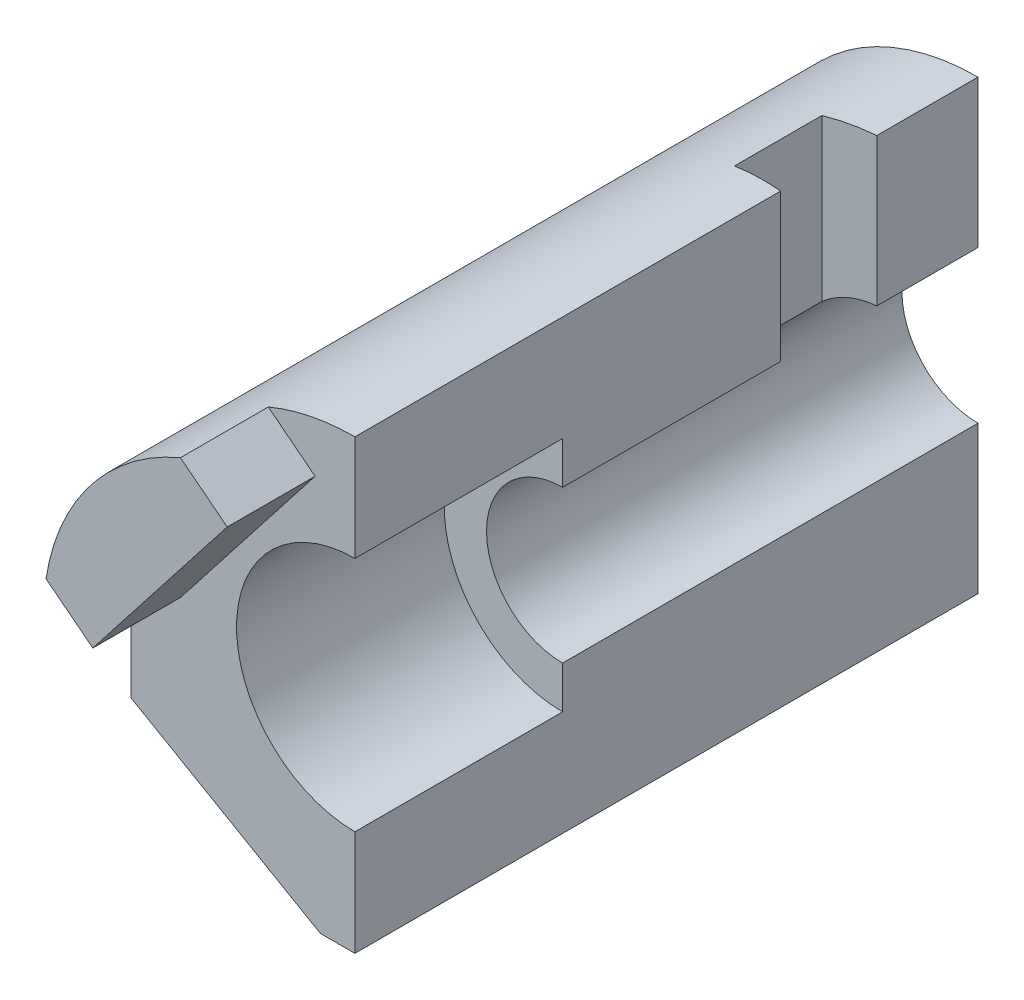
ISO-10303-21;
HEADER;
FILE_DESCRIPTION(('STEP AP214'),'2;1');
FILE_NAME('part.step','',(''),(''),'','','');
FILE_SCHEMA(('AUTOMOTIVE_DESIGN { 1 0 10303 214 1 1 1 1 }'));
ENDSEC;
DATA;
#1=APPLICATION_CONTEXT('core data for automotive mechanical design processes');
#2=APPLICATION_PROTOCOL_DEFINITION('international standard','automotive_design',2000,#1);
#3=PRODUCT_CONTEXT('',#1,'mechanical');
#4=PRODUCT('Part','Part','',(#3));
#5=PRODUCT_RELATED_PRODUCT_CATEGORY('part','',(#4));
#6=PRODUCT_DEFINITION_FORMATION('','',#4);
#7=PRODUCT_DEFINITION_CONTEXT('part definition',#1,'design');
#8=PRODUCT_DEFINITION('design','',#6,#7);
#9=PRODUCT_DEFINITION_SHAPE('','',#8);
#10=(LENGTH_UNIT() NAMED_UNIT(*) SI_UNIT(.MILLI.,.METRE.));
#11=(NAMED_UNIT(*) PLANE_ANGLE_UNIT() SI_UNIT($,.RADIAN.));
#12=(NAMED_UNIT(*) SI_UNIT($,.STERADIAN.) SOLID_ANGLE_UNIT());
#13=UNCERTAINTY_MEASURE_WITH_UNIT(LENGTH_MEASURE(1.E-05),#10,'distance_accuracy_value','');
#14=(GEOMETRIC_REPRESENTATION_CONTEXT(3) GLOBAL_UNCERTAINTY_ASSIGNED_CONTEXT((#13)) GLOBAL_UNIT_ASSIGNED_CONTEXT((#10,
#11,#12)) REPRESENTATION_CONTEXT('',''));
#15=CARTESIAN_POINT('',(0.,0.,0.));
#16=DIRECTION('',(0.,0.,1.));
#17=DIRECTION('',(1.,0.,0.));
#18=AXIS2_PLACEMENT_3D('',#15,#16,#17);
#19=CARTESIAN_POINT('',(112.353614260169,112.575,234.));
#20=DIRECTION('',(-1.,0.,0.));
#21=DIRECTION('',(0.,0.,1.));
#22=AXIS2_PLACEMENT_3D('',#19,#20,#21);
#23=PLANE('',#22);
#24=DIRECTION('',(0.,0.,-1.));
#25=VECTOR('',#24,1.);
#26=CARTESIAN_POINT('',(112.353614260169,112.575,234.));
#27=LINE('',#26,#25);
#28=CARTESIAN_POINT('',(112.353614260169,112.575,156.));
#29=VERTEX_POINT('',#28);
#30=CARTESIAN_POINT('',(112.353614260169,112.575,74.1075289941913));
#31=VERTEX_POINT('',#30);
#32=EDGE_CURVE('E179',#29,#31,#27,.T.);
#33=ORIENTED_EDGE('',*,*,#32,.T.);
#34=DIRECTION('',(0.,1.,0.));
#35=VECTOR('',#34,1.);
#36=CARTESIAN_POINT('',(112.353614260169,-0.001000000000001,74.1075289941913));
#37=LINE('',#36,#35);
#38=CARTESIAN_POINT('',(112.353614260169,168.,74.1075289941913));
#39=VERTEX_POINT('',#38);
#40=EDGE_CURVE('E161',#31,#39,#37,.T.);
#41=ORIENTED_EDGE('',*,*,#40,.T.);
#42=DIRECTION('',(0.,0.,-1.));
#43=VECTOR('',#42,1.);
#44=CARTESIAN_POINT('',(112.353614260169,168.,234.));
#45=LINE('',#44,#43);
#46=CARTESIAN_POINT('',(112.353614260169,168.,234.));
#47=VERTEX_POINT('',#46);
#48=EDGE_CURVE('E190',#47,#39,#45,.T.);
#49=ORIENTED_EDGE('',*,*,#48,.F.);
#50=DIRECTION('',(0.,1.,0.));
#51=VECTOR('',#50,1.);
#52=CARTESIAN_POINT('',(112.353614260169,112.575,234.));
#53=LINE('',#52,#51);
#54=CARTESIAN_POINT('',(112.353614260169,128.45,234.));
#55=VERTEX_POINT('',#54);
#56=EDGE_CURVE('E227',#55,#47,#53,.T.);
#57=ORIENTED_EDGE('',*,*,#56,.F.);
#58=DIRECTION('',(0.,0.,1.));
#59=VECTOR('',#58,1.);
#60=CARTESIAN_POINT('',(112.353614260169,128.45,156.));
#61=LINE('',#60,#59);
#62=CARTESIAN_POINT('',(112.353614260169,128.45,156.));
#63=VERTEX_POINT('',#62);
#64=EDGE_CURVE('E257',#55,#63,#61,.F.);
#65=ORIENTED_EDGE('',*,*,#64,.T.);
#66=DIRECTION('',(0.,1.,0.));
#67=VECTOR('',#66,1.);
#68=CARTESIAN_POINT('',(112.353614260169,112.575,156.));
#69=LINE('',#68,#67);
#70=EDGE_CURVE('E11',#29,#63,#69,.T.);
#71=ORIENTED_EDGE('',*,*,#70,.F.);
#72=EDGE_LOOP('',(#33,#41,#49,#57,#65,#71));
#73=FACE_BOUND('',#72,.T.);
#74=ADVANCED_FACE('F43',(#73),#23,.F.);
#75=CARTESIAN_POINT('',(112.353614260169,84.,234.));
#76=DIRECTION('',(0.,0.,-1.));
#77=DIRECTION('',(-1.,0.,0.));
#78=AXIS2_PLACEMENT_3D('',#75,#76,#77);
#79=CYLINDRICAL_SURFACE('',#78,28.575);
#80=DIRECTION('',(0.,0.,-1.));
#81=VECTOR('',#80,1.);
#82=CARTESIAN_POINT('',(93.353614260169,105.343163425322,234.));
#83=LINE('',#82,#81);
#84=CARTESIAN_POINT('',(93.353614260169,105.343163425322,72.4452443871989));
#85=VERTEX_POINT('',#84);
#86=CARTESIAN_POINT('',(93.353614260169,105.343163425322,39.6622846069925));
#87=VERTEX_POINT('',#86);
#88=EDGE_CURVE('E181',#85,#87,#83,.T.);
#89=ORIENTED_EDGE('',*,*,#88,.F.);
#90=CARTESIAN_POINT('',(112.353614260169,84.,74.1075289941913));
#91=DIRECTION('',(-0.0871557427476515,0.,0.996194698091746));
#92=DIRECTION('',(-0.996194698091746,0.,-0.0871557427476515));
#93=AXIS2_PLACEMENT_3D('',#90,#91,#92);
#94=ELLIPSE('',#93,28.6841518578011,28.575);
#95=EDGE_CURVE('E164',#31,#85,#94,.T.);
#96=ORIENTED_EDGE('',*,*,#95,.F.);
#97=ORIENTED_EDGE('',*,*,#32,.F.);
#98=CARTESIAN_POINT('',(112.353614260169,84.,156.));
#99=DIRECTION('',(0.,0.,1.));
#100=DIRECTION('',(1.,0.,0.));
#101=AXIS2_PLACEMENT_3D('',#98,#99,#100);
#102=CIRCLE('',#101,28.575);
#103=CARTESIAN_POINT('',(112.353614260169,55.425,156.));
#104=VERTEX_POINT('',#103);
#105=EDGE_CURVE('E224',#104,#29,#102,.F.);
#106=ORIENTED_EDGE('',*,*,#105,.F.);
#107=DIRECTION('',(0.,0.,-1.));
#108=VECTOR('',#107,1.);
#109=CARTESIAN_POINT('',(112.353614260169,55.425,234.));
#110=LINE('',#109,#108);
#111=CARTESIAN_POINT('',(112.353614260169,55.425,0.));
#112=VERTEX_POINT('',#111);
#113=EDGE_CURVE('E185',#104,#112,#110,.T.);
#114=ORIENTED_EDGE('',*,*,#113,.T.);
#115=CARTESIAN_POINT('',(112.353614260169,84.,0.));
#116=DIRECTION('',(0.,0.,-1.));
#117=DIRECTION('',(1.,0.,0.));
#118=AXIS2_PLACEMENT_3D('',#115,#116,#117);
#119=CIRCLE('',#118,28.575);
#120=CARTESIAN_POINT('',(112.353614260169,112.575,0.));
#121=VERTEX_POINT('',#120);
#122=EDGE_CURVE('E236',#112,#121,#119,.T.);
#123=ORIENTED_EDGE('',*,*,#122,.T.);
#124=CARTESIAN_POINT('',(112.353614260169,112.575,38.));
#125=VERTEX_POINT('',#124);
#126=EDGE_CURVE('E186',#125,#121,#27,.T.);
#127=ORIENTED_EDGE('',*,*,#126,.F.);
#128=CARTESIAN_POINT('',(112.353614260169,84.,38.));
#129=DIRECTION('',(-0.0871557427476522,0.,-0.996194698091746));
#130=DIRECTION('',(0.996194698091746,0.,-0.0871557427476522));
#131=AXIS2_PLACEMENT_3D('',#128,#129,#130);
#132=ELLIPSE('',#131,28.6841518578011,28.575);
#133=EDGE_CURVE('E58',#87,#125,#132,.T.);
#134=ORIENTED_EDGE('',*,*,#133,.F.);
#135=EDGE_LOOP('',(#89,#96,#97,#106,#114,#123,#127,#134));
#136=FACE_BOUND('',#135,.T.);
#137=ADVANCED_FACE('F177',(#136),#79,.F.);
#138=CARTESIAN_POINT('',(112.353614260169,84.,234.));
#139=DIRECTION('',(0.,0.,-1.));
#140=DIRECTION('',(-1.,0.,0.));
#141=AXIS2_PLACEMENT_3D('',#138,#139,#140);
#142=CYLINDRICAL_SURFACE('',#141,84.);
#143=ORIENTED_EDGE('',*,*,#48,.T.);
#144=CARTESIAN_POINT('',(112.353614260169,84.,74.1075289941913));
#145=DIRECTION('',(-0.0871557427476515,0.,0.996194698091746));
#146=DIRECTION('',(-0.996194698091746,0.,-0.0871557427476515));
#147=AXIS2_PLACEMENT_3D('',#144,#145,#146);
#148=ELLIPSE('',#147,84.3208663536411,84.);
#149=CARTESIAN_POINT('',(93.353614260169,165.822979657307,72.4452443871989));
#150=VERTEX_POINT('',#149);
#151=EDGE_CURVE('E167',#150,#39,#148,.F.);
#152=ORIENTED_EDGE('',*,*,#151,.F.);
#153=DIRECTION('',(0.,0.,-1.));
#154=VECTOR('',#153,1.);
#155=CARTESIAN_POINT('',(93.353614260169,165.822979657307,234.));
#156=LINE('',#155,#154);
#157=CARTESIAN_POINT('',(93.353614260169,165.822979657307,39.6622846069924));
#158=VERTEX_POINT('',#157);
#159=EDGE_CURVE('E287',#158,#150,#156,.F.);
#160=ORIENTED_EDGE('',*,*,#159,.F.);
#161=CARTESIAN_POINT('',(112.353614260169,84.,38.));
#162=DIRECTION('',(-0.0871557427476522,0.,-0.996194698091746));
#163=DIRECTION('',(0.996194698091746,0.,-0.0871557427476522));
#164=AXIS2_PLACEMENT_3D('',#161,#162,#163);
#165=ELLIPSE('',#164,84.3208663536411,84.);
#166=CARTESIAN_POINT('',(112.353614260169,168.,38.));
#167=VERTEX_POINT('',#166);
#168=EDGE_CURVE('E496',#167,#158,#165,.F.);
#169=ORIENTED_EDGE('',*,*,#168,.F.);
#170=CARTESIAN_POINT('',(112.353614260169,168.,0.));
#171=VERTEX_POINT('',#170);
#172=EDGE_CURVE('E216',#167,#171,#45,.T.);
#173=ORIENTED_EDGE('',*,*,#172,.T.);
#174=CARTESIAN_POINT('',(112.353614260169,84.,0.));
#175=DIRECTION('',(0.,0.,1.));
#176=DIRECTION('',(1.,0.,0.));
#177=AXIS2_PLACEMENT_3D('',#174,#175,#176);
#178=CIRCLE('',#177,84.);
#179=CARTESIAN_POINT('',(28.353614260169,84.,0.));
#180=VERTEX_POINT('',#179);
#181=EDGE_CURVE('E213',#171,#180,#178,.T.);
#182=ORIENTED_EDGE('',*,*,#181,.T.);
#183=DIRECTION('',(0.,0.,-1.));
#184=VECTOR('',#183,1.);
#185=CARTESIAN_POINT('',(28.353614260169,84.,234.));
#186=LINE('',#185,#184);
#187=CARTESIAN_POINT('',(28.353614260169,84.,234.));
#188=VERTEX_POINT('',#187);
#189=EDGE_CURVE('E51',#188,#180,#186,.T.);
#190=ORIENTED_EDGE('',*,*,#189,.F.);
#191=CARTESIAN_POINT('',(112.353614260169,84.,234.));
#192=DIRECTION('',(0.,0.,1.));
#193=DIRECTION('',(1.,0.,0.));
#194=AXIS2_PLACEMENT_3D('',#191,#192,#193);
#195=CIRCLE('',#194,84.);
#196=CARTESIAN_POINT('',(29.33896488114,96.8284055313539,234.));
#197=VERTEX_POINT('',#196);
#198=EDGE_CURVE('E239',#197,#188,#195,.T.);
#199=ORIENTED_EDGE('',*,*,#198,.F.);
#200=DIRECTION('',(0.,0.,-1.));
#201=VECTOR('',#200,1.);
#202=CARTESIAN_POINT('',(29.33896488114,96.8284055313539,267.));
#203=LINE('',#202,#201);
#204=CARTESIAN_POINT('',(29.33896488114,96.8284055313539,267.));
#205=VERTEX_POINT('',#204);
#206=EDGE_CURVE('E313',#205,#197,#203,.T.);
#207=ORIENTED_EDGE('',*,*,#206,.F.);
#208=CARTESIAN_POINT('',(112.353614260169,83.9999999999996,267.));
#209=DIRECTION('',(0.,0.,1.));
#210=DIRECTION('',(-1.,0.,0.));
#211=AXIS2_PLACEMENT_3D('',#208,#209,#210);
#212=CIRCLE('',#211,84.0000000000005);
#213=CARTESIAN_POINT('',(79.8232058578435,161.445287327105,267.));
#214=VERTEX_POINT('',#213);
#215=EDGE_CURVE('E295',#214,#205,#212,.T.);
#216=ORIENTED_EDGE('',*,*,#215,.F.);
#217=DIRECTION('',(0.,0.,-1.));
#218=VECTOR('',#217,1.);
#219=CARTESIAN_POINT('',(79.8232058578435,161.445287327105,267.));
#220=LINE('',#219,#218);
#221=CARTESIAN_POINT('',(79.8232058578435,161.445287327105,234.));
#222=VERTEX_POINT('',#221);
#223=EDGE_CURVE('E316',#214,#222,#220,.T.);
#224=ORIENTED_EDGE('',*,*,#223,.T.);
#225=EDGE_CURVE('E241',#47,#222,#195,.T.);
#226=ORIENTED_EDGE('',*,*,#225,.F.);
#227=EDGE_LOOP('',(#143,#152,#160,#169,#173,#182,#190,#199,#207,#216,#224,#226));
#228=FACE_BOUND('',#227,.T.);
#229=ADVANCED_FACE('F45',(#228),#142,.T.);
#230=CARTESIAN_POINT('',(28.353614260169,84.,234.));
#231=DIRECTION('',(1.,0.,0.));
#232=DIRECTION('',(0.,1.,0.));
#233=AXIS2_PLACEMENT_3D('',#230,#231,#232);
#234=PLANE('',#233);
#235=DIRECTION('',(0.,-1.,0.));
#236=VECTOR('',#235,1.);
#237=CARTESIAN_POINT('',(28.353614260169,84.,0.));
#238=LINE('',#237,#236);
#239=CARTESIAN_POINT('',(28.353614260169,40.9918691124635,0.));
#240=VERTEX_POINT('',#239);
#241=EDGE_CURVE('E208',#180,#240,#238,.T.);
#242=ORIENTED_EDGE('',*,*,#241,.T.);
#243=DIRECTION('',(0.,0.,-1.));
#244=VECTOR('',#243,1.);
#245=CARTESIAN_POINT('',(28.353614260169,40.9918691124635,234.));
#246=LINE('',#245,#244);
#247=CARTESIAN_POINT('',(28.353614260169,40.9918691124635,234.));
#248=VERTEX_POINT('',#247);
#249=EDGE_CURVE('E199',#248,#240,#246,.T.);
#250=ORIENTED_EDGE('',*,*,#249,.F.);
#251=DIRECTION('',(0.,-1.,0.));
#252=VECTOR('',#251,1.);
#253=CARTESIAN_POINT('',(28.353614260169,84.,234.));
#254=LINE('',#253,#252);
#255=EDGE_CURVE('E209',#188,#248,#254,.T.);
#256=ORIENTED_EDGE('',*,*,#255,.F.);
#257=ORIENTED_EDGE('',*,*,#189,.T.);
#258=EDGE_LOOP('',(#242,#250,#256,#257));
#259=FACE_BOUND('',#258,.T.);
#260=ADVANCED_FACE('F206',(#259),#234,.F.);
#261=CARTESIAN_POINT('',(28.353614260169,40.9918691124635,234.));
#262=DIRECTION('',(0.500000000000001,0.866025403784438,0.));
#263=DIRECTION('',(-0.866025403784438,0.500000000000001,0.));
#264=AXIS2_PLACEMENT_3D('',#261,#262,#263);
#265=PLANE('',#264);
#266=DIRECTION('',(0.866025403784438,-0.500000000000001,0.));
#267=VECTOR('',#266,1.);
#268=CARTESIAN_POINT('',(28.353614260169,40.9918691124635,0.));
#269=LINE('',#268,#267);
#270=CARTESIAN_POINT('',(99.353614260169,0.,0.));
#271=VERTEX_POINT('',#270);
#272=EDGE_CURVE('E222',#240,#271,#269,.T.);
#273=ORIENTED_EDGE('',*,*,#272,.T.);
#274=DIRECTION('',(0.,0.,-1.));
#275=VECTOR('',#274,1.);
#276=CARTESIAN_POINT('',(99.353614260169,0.,234.));
#277=LINE('',#276,#275);
#278=CARTESIAN_POINT('',(99.353614260169,0.,234.));
#279=VERTEX_POINT('',#278);
#280=EDGE_CURVE('E196',#279,#271,#277,.T.);
#281=ORIENTED_EDGE('',*,*,#280,.F.);
#282=DIRECTION('',(0.866025403784438,-0.500000000000001,0.));
#283=VECTOR('',#282,1.);
#284=CARTESIAN_POINT('',(28.353614260169,40.9918691124635,234.));
#285=LINE('',#284,#283);
#286=EDGE_CURVE('E246',#248,#279,#285,.T.);
#287=ORIENTED_EDGE('',*,*,#286,.F.);
#288=ORIENTED_EDGE('',*,*,#249,.T.);
#289=EDGE_LOOP('',(#273,#281,#287,#288));
#290=FACE_BOUND('',#289,.T.);
#291=ADVANCED_FACE('F343',(#290),#265,.F.);
#292=CARTESIAN_POINT('',(99.353614260169,0.,234.));
#293=DIRECTION('',(0.,1.,0.));
#294=DIRECTION('',(-1.,0.,0.));
#295=AXIS2_PLACEMENT_3D('',#292,#293,#294);
#296=PLANE('',#295);
#297=DIRECTION('',(1.,0.,0.));
#298=VECTOR('',#297,1.);
#299=CARTESIAN_POINT('',(99.353614260169,0.,0.));
#300=LINE('',#299,#298);
#301=CARTESIAN_POINT('',(112.353614260169,0.,0.));
#302=VERTEX_POINT('',#301);
#303=EDGE_CURVE('E231',#271,#302,#300,.T.);
#304=ORIENTED_EDGE('',*,*,#303,.T.);
#305=DIRECTION('',(0.,0.,-1.));
#306=VECTOR('',#305,1.);
#307=CARTESIAN_POINT('',(112.353614260169,0.,234.));
#308=LINE('',#307,#306);
#309=CARTESIAN_POINT('',(112.353614260169,0.,234.));
#310=VERTEX_POINT('',#309);
#311=EDGE_CURVE('E188',#310,#302,#308,.T.);
#312=ORIENTED_EDGE('',*,*,#311,.F.);
#313=DIRECTION('',(1.,0.,0.));
#314=VECTOR('',#313,1.);
#315=CARTESIAN_POINT('',(99.353614260169,0.,234.));
#316=LINE('',#315,#314);
#317=EDGE_CURVE('E248',#279,#310,#316,.T.);
#318=ORIENTED_EDGE('',*,*,#317,.F.);
#319=ORIENTED_EDGE('',*,*,#280,.T.);
#320=EDGE_LOOP('',(#304,#312,#318,#319));
#321=FACE_BOUND('',#320,.T.);
#322=ADVANCED_FACE('F340',(#321),#296,.F.);
#323=CARTESIAN_POINT('',(112.353614260169,0.,234.));
#324=DIRECTION('',(-1.,0.,0.));
#325=DIRECTION('',(0.,0.,1.));
#326=AXIS2_PLACEMENT_3D('',#323,#324,#325);
#327=PLANE('',#326);
#328=DIRECTION('',(0.,1.,0.));
#329=VECTOR('',#328,1.);
#330=CARTESIAN_POINT('',(112.353614260169,0.,156.));
#331=LINE('',#330,#329);
#332=CARTESIAN_POINT('',(112.353614260169,39.55,156.));
#333=VERTEX_POINT('',#332);
#334=EDGE_CURVE('E220',#333,#104,#331,.T.);
#335=ORIENTED_EDGE('',*,*,#334,.F.);
#336=DIRECTION('',(0.,0.,1.));
#337=VECTOR('',#336,1.);
#338=CARTESIAN_POINT('',(112.353614260169,39.55,156.));
#339=LINE('',#338,#337);
#340=CARTESIAN_POINT('',(112.353614260169,39.55,234.));
#341=VERTEX_POINT('',#340);
#342=EDGE_CURVE('E260',#333,#341,#339,.T.);
#343=ORIENTED_EDGE('',*,*,#342,.T.);
#344=DIRECTION('',(0.,1.,0.));
#345=VECTOR('',#344,1.);
#346=CARTESIAN_POINT('',(112.353614260169,0.,234.));
#347=LINE('',#346,#345);
#348=EDGE_CURVE('E249',#310,#341,#347,.T.);
#349=ORIENTED_EDGE('',*,*,#348,.F.);
#350=ORIENTED_EDGE('',*,*,#311,.T.);
#351=DIRECTION('',(0.,1.,0.));
#352=VECTOR('',#351,1.);
#353=CARTESIAN_POINT('',(112.353614260169,0.,0.));
#354=LINE('',#353,#352);
#355=EDGE_CURVE('E233',#302,#112,#354,.T.);
#356=ORIENTED_EDGE('',*,*,#355,.T.);
#357=ORIENTED_EDGE('',*,*,#113,.F.);
#358=EDGE_LOOP('',(#335,#343,#349,#350,#356,#357));
#359=FACE_BOUND('',#358,.T.);
#360=ADVANCED_FACE('F274',(#359),#327,.F.);
#361=ORIENTED_EDGE('',*,*,#172,.F.);
#362=DIRECTION('',(0.,1.,0.));
#363=VECTOR('',#362,1.);
#364=CARTESIAN_POINT('',(112.353614260169,-0.001000000000001,38.));
#365=LINE('',#364,#363);
#366=EDGE_CURVE('E173',#125,#167,#365,.T.);
#367=ORIENTED_EDGE('',*,*,#366,.F.);
#368=ORIENTED_EDGE('',*,*,#126,.T.);
#369=DIRECTION('',(0.,1.,0.));
#370=VECTOR('',#369,1.);
#371=CARTESIAN_POINT('',(112.353614260169,112.575,0.));
#372=LINE('',#371,#370);
#373=EDGE_CURVE('E238',#121,#171,#372,.T.);
#374=ORIENTED_EDGE('',*,*,#373,.T.);
#375=EDGE_LOOP('',(#361,#367,#368,#374));
#376=FACE_BOUND('',#375,.T.);
#377=ADVANCED_FACE('F281',(#376),#23,.F.);
#378=CARTESIAN_POINT('',(112.353614260169,84.,234.));
#379=DIRECTION('',(0.,0.,1.));
#380=DIRECTION('',(1.,0.,0.));
#381=AXIS2_PLACEMENT_3D('',#378,#379,#380);
#382=PLANE('',#381);
#383=DIRECTION('',(-0.788010753606725,0.615661475325654,0.));
#384=VECTOR('',#383,1.);
#385=CARTESIAN_POINT('',(97.4071863145778,147.707176139484,234.));
#386=LINE('',#385,#384);
#387=CARTESIAN_POINT('',(97.4071863145778,147.707176139484,234.));
#388=VERTEX_POINT('',#387);
#389=EDGE_CURVE('E66',#388,#222,#386,.T.);
#390=ORIENTED_EDGE('',*,*,#389,.F.);
#391=DIRECTION('',(0.615661475325654,0.788010753606725,0.));
#392=VECTOR('',#391,1.);
#393=CARTESIAN_POINT('',(46.9229453378742,83.0902943437326,234.));
#394=LINE('',#393,#392);
#395=CARTESIAN_POINT('',(46.9229453378742,83.0902943437326,234.));
#396=VERTEX_POINT('',#395);
#397=EDGE_CURVE('E296',#396,#388,#394,.T.);
#398=ORIENTED_EDGE('',*,*,#397,.F.);
#399=DIRECTION('',(0.788010753606726,-0.615661475325653,0.));
#400=VECTOR('',#399,1.);
#401=CARTESIAN_POINT('',(46.9229453378742,83.0902943437326,234.));
#402=LINE('',#401,#400);
#403=EDGE_CURVE('E304',#197,#396,#402,.T.);
#404=ORIENTED_EDGE('',*,*,#403,.F.);
#405=ORIENTED_EDGE('',*,*,#198,.T.);
#406=ORIENTED_EDGE('',*,*,#255,.T.);
#407=ORIENTED_EDGE('',*,*,#286,.T.);
#408=ORIENTED_EDGE('',*,*,#317,.T.);
#409=ORIENTED_EDGE('',*,*,#348,.T.);
#410=CARTESIAN_POINT('',(112.353614260169,84.,234.));
#411=DIRECTION('',(0.,0.,1.));
#412=DIRECTION('',(1.,0.,0.));
#413=AXIS2_PLACEMENT_3D('',#410,#411,#412);
#414=CIRCLE('',#413,44.45);
#415=EDGE_CURVE('E266',#55,#341,#414,.T.);
#416=ORIENTED_EDGE('',*,*,#415,.F.);
#417=ORIENTED_EDGE('',*,*,#56,.T.);
#418=ORIENTED_EDGE('',*,*,#225,.T.);
#419=EDGE_LOOP('',(#390,#398,#404,#405,#406,#407,#408,#409,#416,#417,#418));
#420=FACE_BOUND('',#419,.T.);
#421=ADVANCED_FACE('F319',(#420),#382,.T.);
#422=CARTESIAN_POINT('',(112.353614260169,84.,0.));
#423=DIRECTION('',(0.,0.,1.));
#424=DIRECTION('',(1.,0.,0.));
#425=AXIS2_PLACEMENT_3D('',#422,#423,#424);
#426=PLANE('',#425);
#427=ORIENTED_EDGE('',*,*,#181,.F.);
#428=ORIENTED_EDGE('',*,*,#373,.F.);
#429=ORIENTED_EDGE('',*,*,#122,.F.);
#430=ORIENTED_EDGE('',*,*,#355,.F.);
#431=ORIENTED_EDGE('',*,*,#303,.F.);
#432=ORIENTED_EDGE('',*,*,#272,.F.);
#433=ORIENTED_EDGE('',*,*,#241,.F.);
#434=EDGE_LOOP('',(#427,#428,#429,#430,#431,#432,#433));
#435=FACE_BOUND('',#434,.T.);
#436=ADVANCED_FACE('F279',(#435),#426,.F.);
#437=CARTESIAN_POINT('',(112.353614260169,84.,156.));
#438=DIRECTION('',(0.,0.,1.));
#439=DIRECTION('',(1.,0.,0.));
#440=AXIS2_PLACEMENT_3D('',#437,#438,#439);
#441=PLANE('',#440);
#442=ORIENTED_EDGE('',*,*,#334,.T.);
#443=ORIENTED_EDGE('',*,*,#105,.T.);
#444=ORIENTED_EDGE('',*,*,#70,.T.);
#445=CARTESIAN_POINT('',(112.353614260169,84.,156.));
#446=DIRECTION('',(0.,0.,1.));
#447=DIRECTION('',(1.,0.,0.));
#448=AXIS2_PLACEMENT_3D('',#445,#446,#447);
#449=CIRCLE('',#448,44.45);
#450=EDGE_CURVE('E261',#63,#333,#449,.T.);
#451=ORIENTED_EDGE('',*,*,#450,.T.);
#452=EDGE_LOOP('',(#442,#443,#444,#451));
#453=FACE_BOUND('',#452,.T.);
#454=ADVANCED_FACE('F270',(#453),#441,.T.);
#455=CARTESIAN_POINT('',(112.353614260169,84.,156.));
#456=DIRECTION('',(0.,0.,1.));
#457=DIRECTION('',(1.,0.,0.));
#458=AXIS2_PLACEMENT_3D('',#455,#456,#457);
#459=CYLINDRICAL_SURFACE('',#458,44.45);
#460=ORIENTED_EDGE('',*,*,#450,.F.);
#461=ORIENTED_EDGE('',*,*,#64,.F.);
#462=ORIENTED_EDGE('',*,*,#415,.T.);
#463=ORIENTED_EDGE('',*,*,#342,.F.);
#464=EDGE_LOOP('',(#460,#461,#462,#463));
#465=FACE_BOUND('',#464,.T.);
#466=ADVANCED_FACE('F318',(#465),#459,.F.);
#467=CARTESIAN_POINT('',(97.4071863145778,147.707176139484,267.));
#468=DIRECTION('',(-0.615661475325654,-0.788010753606725,0.));
#469=DIRECTION('',(0.788010753606726,-0.615661475325654,0.));
#470=AXIS2_PLACEMENT_3D('',#467,#468,#469);
#471=PLANE('',#470);
#472=ORIENTED_EDGE('',*,*,#389,.T.);
#473=ORIENTED_EDGE('',*,*,#223,.F.);
#474=DIRECTION('',(-0.788010753606725,0.615661475325654,0.));
#475=VECTOR('',#474,1.);
#476=CARTESIAN_POINT('',(97.4071863145778,147.707176139484,267.));
#477=LINE('',#476,#475);
#478=CARTESIAN_POINT('',(97.4071863145778,147.707176139484,267.));
#479=VERTEX_POINT('',#478);
#480=EDGE_CURVE('E292',#479,#214,#477,.T.);
#481=ORIENTED_EDGE('',*,*,#480,.F.);
#482=DIRECTION('',(0.,0.,-1.));
#483=VECTOR('',#482,1.);
#484=CARTESIAN_POINT('',(97.4071863145778,147.707176139484,267.));
#485=LINE('',#484,#483);
#486=EDGE_CURVE('E302',#479,#388,#485,.T.);
#487=ORIENTED_EDGE('',*,*,#486,.T.);
#488=EDGE_LOOP('',(#472,#473,#481,#487));
#489=FACE_BOUND('',#488,.T.);
#490=ADVANCED_FACE('F420',(#489),#471,.F.);
#491=CARTESIAN_POINT('',(46.9229453378742,83.0902943437326,267.));
#492=DIRECTION('',(0.615661475325653,0.788010753606726,0.));
#493=DIRECTION('',(-0.788010753606726,0.615661475325653,0.));
#494=AXIS2_PLACEMENT_3D('',#491,#492,#493);
#495=PLANE('',#494);
#496=ORIENTED_EDGE('',*,*,#403,.T.);
#497=DIRECTION('',(0.,0.,-1.));
#498=VECTOR('',#497,1.);
#499=CARTESIAN_POINT('',(46.9229453378742,83.0902943437326,267.));
#500=LINE('',#499,#498);
#501=CARTESIAN_POINT('',(46.9229453378742,83.0902943437326,267.));
#502=VERTEX_POINT('',#501);
#503=EDGE_CURVE('E310',#502,#396,#500,.T.);
#504=ORIENTED_EDGE('',*,*,#503,.F.);
#505=DIRECTION('',(0.788010753606726,-0.615661475325653,0.));
#506=VECTOR('',#505,1.);
#507=CARTESIAN_POINT('',(46.9229453378742,83.0902943437326,267.));
#508=LINE('',#507,#506);
#509=EDGE_CURVE('E298',#205,#502,#508,.T.);
#510=ORIENTED_EDGE('',*,*,#509,.F.);
#511=ORIENTED_EDGE('',*,*,#206,.T.);
#512=EDGE_LOOP('',(#496,#504,#510,#511));
#513=FACE_BOUND('',#512,.T.);
#514=ADVANCED_FACE('F411',(#513),#495,.F.);
#515=CARTESIAN_POINT('',(46.9229453378742,83.0902943437326,267.));
#516=DIRECTION('',(-0.788010753606726,0.615661475325654,0.));
#517=DIRECTION('',(-0.615661475325654,-0.788010753606726,0.));
#518=AXIS2_PLACEMENT_3D('',#515,#516,#517);
#519=PLANE('',#518);
#520=ORIENTED_EDGE('',*,*,#397,.T.);
#521=ORIENTED_EDGE('',*,*,#486,.F.);
#522=DIRECTION('',(0.615661475325654,0.788010753606725,0.));
#523=VECTOR('',#522,1.);
#524=CARTESIAN_POINT('',(46.9229453378742,83.0902943437326,267.));
#525=LINE('',#524,#523);
#526=EDGE_CURVE('E300',#502,#479,#525,.T.);
#527=ORIENTED_EDGE('',*,*,#526,.F.);
#528=ORIENTED_EDGE('',*,*,#503,.T.);
#529=EDGE_LOOP('',(#520,#521,#527,#528));
#530=FACE_BOUND('',#529,.T.);
#531=ADVANCED_FACE('F402',(#530),#519,.F.);
#532=CARTESIAN_POINT('',(112.353614260169,83.9999999999996,267.));
#533=DIRECTION('',(0.,0.,-1.));
#534=DIRECTION('',(-1.,0.,0.));
#535=AXIS2_PLACEMENT_3D('',#532,#533,#534);
#536=PLANE('',#535);
#537=ORIENTED_EDGE('',*,*,#480,.T.);
#538=ORIENTED_EDGE('',*,*,#215,.T.);
#539=ORIENTED_EDGE('',*,*,#509,.T.);
#540=ORIENTED_EDGE('',*,*,#526,.T.);
#541=EDGE_LOOP('',(#537,#538,#539,#540));
#542=FACE_BOUND('',#541,.T.);
#543=ADVANCED_FACE('F371',(#542),#536,.F.);
#544=CARTESIAN_POINT('',(93.353614260169,-0.001000000000001,39.6622846069924));
#545=DIRECTION('',(-1.,0.,0.));
#546=DIRECTION('',(0.,0.,1.));
#547=AXIS2_PLACEMENT_3D('',#544,#545,#546);
#548=PLANE('',#547);
#549=ORIENTED_EDGE('',*,*,#88,.T.);
#550=DIRECTION('',(0.,1.,0.));
#551=VECTOR('',#550,1.);
#552=CARTESIAN_POINT('',(93.353614260169,-0.001000000000001,39.6622846069924));
#553=LINE('',#552,#551);
#554=EDGE_CURVE('E172',#87,#158,#553,.T.);
#555=ORIENTED_EDGE('',*,*,#554,.T.);
#556=ORIENTED_EDGE('',*,*,#159,.T.);
#557=DIRECTION('',(0.,1.,0.));
#558=VECTOR('',#557,1.);
#559=CARTESIAN_POINT('',(93.353614260169,-0.001000000000001,72.4452443871989));
#560=LINE('',#559,#558);
#561=EDGE_CURVE('E283',#85,#150,#560,.T.);
#562=ORIENTED_EDGE('',*,*,#561,.F.);
#563=EDGE_LOOP('',(#549,#555,#556,#562));
#564=FACE_BOUND('',#563,.T.);
#565=ADVANCED_FACE('F367',(#564),#548,.F.);
#566=CARTESIAN_POINT('',(93.353614260169,-0.001000000000001,72.4452443871989));
#567=DIRECTION('',(-0.0871557427476515,0.,0.996194698091746));
#568=DIRECTION('',(0.996194698091746,0.,0.0871557427476515));
#569=AXIS2_PLACEMENT_3D('',#566,#567,#568);
#570=PLANE('',#569);
#571=ORIENTED_EDGE('',*,*,#95,.T.);
#572=ORIENTED_EDGE('',*,*,#561,.T.);
#573=ORIENTED_EDGE('',*,*,#151,.T.);
#574=ORIENTED_EDGE('',*,*,#40,.F.);
#575=EDGE_LOOP('',(#571,#572,#573,#574));
#576=FACE_BOUND('',#575,.T.);
#577=ADVANCED_FACE('F163',(#576),#570,.F.);
#578=CARTESIAN_POINT('',(93.353614260169,-0.001000000000001,39.6622846069924));
#579=DIRECTION('',(-0.0871557427476522,0.,-0.996194698091746));
#580=DIRECTION('',(-0.996194698091746,0.,0.0871557427476522));
#581=AXIS2_PLACEMENT_3D('',#578,#579,#580);
#582=PLANE('',#581);
#583=ORIENTED_EDGE('',*,*,#133,.T.);
#584=ORIENTED_EDGE('',*,*,#366,.T.);
#585=ORIENTED_EDGE('',*,*,#168,.T.);
#586=ORIENTED_EDGE('',*,*,#554,.F.);
#587=EDGE_LOOP('',(#583,#584,#585,#586));
#588=FACE_BOUND('',#587,.T.);
#589=ADVANCED_FACE('F381',(#588),#582,.F.);
#590=CLOSED_SHELL('',(#74,#137,#229,#260,#291,#322,#360,#377,#421,#436,#454,#466,#490,#514,#531,
#543,#565,#577,#589));
#591=MANIFOLD_SOLID_BREP('B2',#590);
#592=ADVANCED_BREP_SHAPE_REPRESENTATION('',(#18,#591),#14);
#593=SHAPE_DEFINITION_REPRESENTATION(#9,#592);
ENDSEC;
END-ISO-10303-21;
